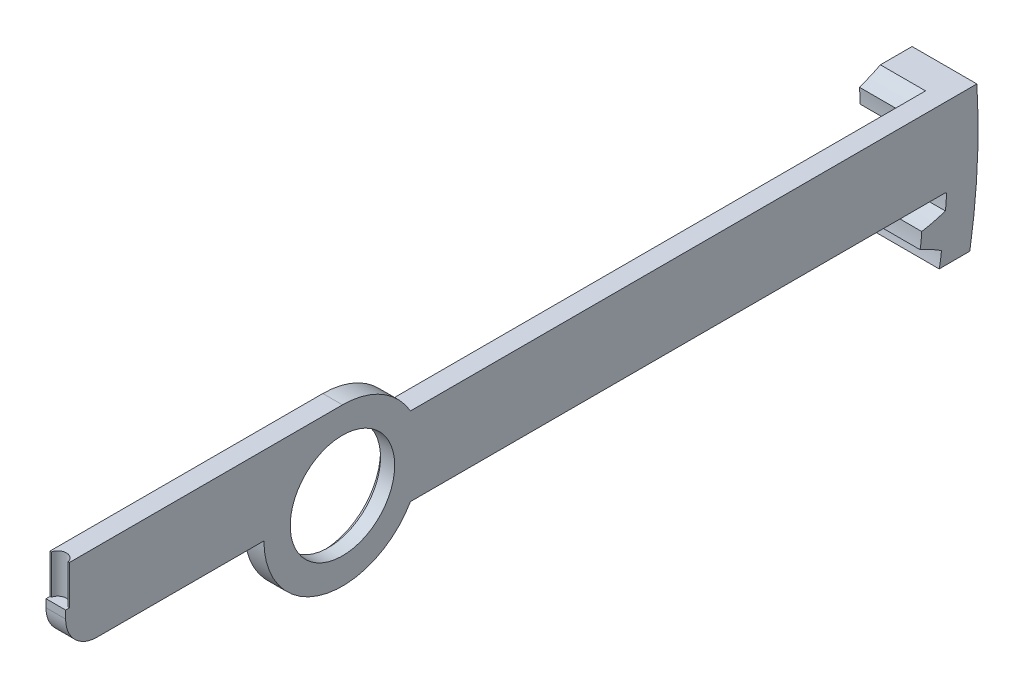
ISO-10303-21;
HEADER;
FILE_DESCRIPTION(('STEP AP214'),'2;1');
FILE_NAME('part.step','',(''),(''),'','','');
FILE_SCHEMA(('AUTOMOTIVE_DESIGN { 1 0 10303 214 1 1 1 1 }'));
ENDSEC;
DATA;
#1=APPLICATION_CONTEXT('core data for automotive mechanical design processes');
#2=APPLICATION_PROTOCOL_DEFINITION('international standard','automotive_design',2000,#1);
#3=PRODUCT_CONTEXT('',#1,'mechanical');
#4=PRODUCT('Part','Part','',(#3));
#5=PRODUCT_RELATED_PRODUCT_CATEGORY('part','',(#4));
#6=PRODUCT_DEFINITION_FORMATION('','',#4);
#7=PRODUCT_DEFINITION_CONTEXT('part definition',#1,'design');
#8=PRODUCT_DEFINITION('design','',#6,#7);
#9=PRODUCT_DEFINITION_SHAPE('','',#8);
#10=(LENGTH_UNIT() NAMED_UNIT(*) SI_UNIT(.MILLI.,.METRE.));
#11=(NAMED_UNIT(*) PLANE_ANGLE_UNIT() SI_UNIT($,.RADIAN.));
#12=(NAMED_UNIT(*) SI_UNIT($,.STERADIAN.) SOLID_ANGLE_UNIT());
#13=UNCERTAINTY_MEASURE_WITH_UNIT(LENGTH_MEASURE(1.E-05),#10,'distance_accuracy_value','');
#14=(GEOMETRIC_REPRESENTATION_CONTEXT(3) GLOBAL_UNCERTAINTY_ASSIGNED_CONTEXT((#13)) GLOBAL_UNIT_ASSIGNED_CONTEXT((#10,
#11,#12)) REPRESENTATION_CONTEXT('',''));
#15=CARTESIAN_POINT('',(0.,0.,0.));
#16=DIRECTION('',(0.,0.,1.));
#17=DIRECTION('',(1.,0.,0.));
#18=AXIS2_PLACEMENT_3D('',#15,#16,#17);
#19=CARTESIAN_POINT('',(1.25,0.,0.));
#20=DIRECTION('',(1.,0.,0.));
#21=DIRECTION('',(0.,0.,-1.));
#22=AXIS2_PLACEMENT_3D('',#19,#20,#21);
#23=PLANE('',#22);
#24=CARTESIAN_POINT('',(1.25,0.,0.));
#25=DIRECTION('',(1.,0.,0.));
#26=DIRECTION('',(0.,0.,-1.));
#27=AXIS2_PLACEMENT_3D('',#24,#25,#26);
#28=CIRCLE('',#27,6.65);
#29=CARTESIAN_POINT('',(1.25,0.,-6.65));
#30=VERTEX_POINT('',#29);
#31=EDGE_CURVE('E342',#30,#30,#28,.T.);
#32=ORIENTED_EDGE('',*,*,#31,.F.);
#33=EDGE_LOOP('',(#32));
#34=FACE_BOUND('',#33,.T.);
#35=CARTESIAN_POINT('',(1.25,0.,0.));
#36=DIRECTION('',(1.,0.,0.));
#37=DIRECTION('',(0.,0.,-1.));
#38=AXIS2_PLACEMENT_3D('',#35,#36,#37);
#39=CIRCLE('',#38,80.9419522496424);
#40=CARTESIAN_POINT('',(1.25,-13.,-79.8911736926139));
#41=VERTEX_POINT('',#40);
#42=CARTESIAN_POINT('',(1.25,5.00000000000251,-80.7873729860266));
#43=VERTEX_POINT('',#42);
#44=EDGE_CURVE('E273',#41,#43,#39,.T.);
#45=ORIENTED_EDGE('',*,*,#44,.T.);
#46=DIRECTION('',(0.,0.,-1.));
#47=VECTOR('',#46,1.);
#48=CARTESIAN_POINT('',(1.25,5.00000000000256,0.));
#49=LINE('',#48,#47);
#50=CARTESIAN_POINT('',(1.25,5.00000000000215,-8.66025403784314));
#51=VERTEX_POINT('',#50);
#52=EDGE_CURVE('E333',#51,#43,#49,.T.);
#53=ORIENTED_EDGE('',*,*,#52,.F.);
#54=CARTESIAN_POINT('',(1.25,0.,0.));
#55=DIRECTION('',(1.,0.,0.));
#56=DIRECTION('',(0.,0.,-1.));
#57=AXIS2_PLACEMENT_3D('',#54,#55,#56);
#58=CIRCLE('',#57,10.);
#59=CARTESIAN_POINT('',(1.25,9.99999999999999,0.));
#60=VERTEX_POINT('',#59);
#61=EDGE_CURVE('E330',#51,#60,#58,.T.);
#62=ORIENTED_EDGE('',*,*,#61,.T.);
#63=DIRECTION('',(0.,0.,1.));
#64=VECTOR('',#63,1.);
#65=CARTESIAN_POINT('',(1.25,9.99999999999999,0.));
#66=LINE('',#65,#64);
#67=CARTESIAN_POINT('',(1.25,9.99999999999999,34.75));
#68=VERTEX_POINT('',#67);
#69=EDGE_CURVE('E335',#60,#68,#66,.T.);
#70=ORIENTED_EDGE('',*,*,#69,.T.);
#71=DIRECTION('',(0.,-1.,0.));
#72=VECTOR('',#71,1.);
#73=CARTESIAN_POINT('',(1.25,0.,34.75));
#74=LINE('',#73,#72);
#75=CARTESIAN_POINT('',(1.25,4.99999999999999,34.75));
#76=VERTEX_POINT('',#75);
#77=EDGE_CURVE('E337',#68,#76,#74,.T.);
#78=ORIENTED_EDGE('',*,*,#77,.T.);
#79=DIRECTION('',(0.,0.,-1.));
#80=VECTOR('',#79,1.);
#81=CARTESIAN_POINT('',(1.25,4.99999999999999,0.));
#82=LINE('',#81,#80);
#83=CARTESIAN_POINT('',(1.25,4.99999999999999,35.25));
#84=VERTEX_POINT('',#83);
#85=EDGE_CURVE('E339',#84,#76,#82,.T.);
#86=ORIENTED_EDGE('',*,*,#85,.F.);
#87=DIRECTION('',(0.,-1.,0.));
#88=VECTOR('',#87,1.);
#89=CARTESIAN_POINT('',(1.25,0.,35.25));
#90=LINE('',#89,#88);
#91=CARTESIAN_POINT('',(1.25,4.00000000000002,35.25));
#92=VERTEX_POINT('',#91);
#93=EDGE_CURVE('E318',#84,#92,#90,.T.);
#94=ORIENTED_EDGE('',*,*,#93,.T.);
#95=CARTESIAN_POINT('',(1.25,4.,31.25));
#96=DIRECTION('',(1.,0.,0.));
#97=DIRECTION('',(0.,0.,-1.));
#98=AXIS2_PLACEMENT_3D('',#95,#96,#97);
#99=CIRCLE('',#98,4.);
#100=CARTESIAN_POINT('',(1.25,0.,31.25));
#101=VERTEX_POINT('',#100);
#102=EDGE_CURVE('E321',#92,#101,#99,.T.);
#103=ORIENTED_EDGE('',*,*,#102,.T.);
#104=DIRECTION('',(0.,0.,1.));
#105=VECTOR('',#104,1.);
#106=CARTESIAN_POINT('',(1.25,0.,0.));
#107=LINE('',#106,#105);
#108=CARTESIAN_POINT('',(1.25,0.,10.));
#109=VERTEX_POINT('',#108);
#110=EDGE_CURVE('E324',#109,#101,#107,.T.);
#111=ORIENTED_EDGE('',*,*,#110,.F.);
#112=CARTESIAN_POINT('',(1.25,-5.00000000000216,-8.66025403784314));
#113=VERTEX_POINT('',#112);
#114=EDGE_CURVE('E327',#109,#113,#58,.T.);
#115=ORIENTED_EDGE('',*,*,#114,.T.);
#116=DIRECTION('',(0.,0.,1.));
#117=VECTOR('',#116,1.);
#118=CARTESIAN_POINT('',(1.25,-5.00000000000211,0.));
#119=LINE('',#118,#117);
#120=CARTESIAN_POINT('',(1.25,-5.00000000000254,-76.7218475415711));
#121=VERTEX_POINT('',#120);
#122=EDGE_CURVE('E329',#121,#113,#119,.T.);
#123=ORIENTED_EDGE('',*,*,#122,.F.);
#124=CARTESIAN_POINT('',(1.25,-23.6162162985407,-67.1556357708977));
#125=DIRECTION('',(1.,0.,0.));
#126=DIRECTION('',(0.,0.,-1.));
#127=AXIS2_PLACEMENT_3D('',#124,#125,#126);
#128=CIRCLE('',#127,20.9302631831359);
#129=CARTESIAN_POINT('',(1.25,-5.1035048029999,-76.9206462674721));
#130=VERTEX_POINT('',#129);
#131=EDGE_CURVE('E276',#130,#121,#128,.T.);
#132=ORIENTED_EDGE('',*,*,#131,.F.);
#133=CARTESIAN_POINT('',(1.25,-4.60571823015363,-57.9501761356954));
#134=DIRECTION('',(1.,0.,0.));
#135=DIRECTION('',(0.,0.,-1.));
#136=AXIS2_PLACEMENT_3D('',#133,#134,#135);
#137=CIRCLE('',#136,18.9769999866347);
#138=CARTESIAN_POINT('',(1.25,-7.00493193495975,-76.7749019528595));
#139=VERTEX_POINT('',#138);
#140=EDGE_CURVE('E279',#130,#139,#137,.F.);
#141=ORIENTED_EDGE('',*,*,#140,.T.);
#142=CARTESIAN_POINT('',(1.25,10.9578906175946,-70.6255537554951));
#143=DIRECTION('',(1.,0.,0.));
#144=DIRECTION('',(0.,0.,-1.));
#145=AXIS2_PLACEMENT_3D('',#142,#143,#144);
#146=CIRCLE('',#145,18.9862444234499);
#147=CARTESIAN_POINT('',(1.25,-7.76663181357915,-73.7671675177918));
#148=VERTEX_POINT('',#147);
#149=EDGE_CURVE('E281',#148,#139,#146,.T.);
#150=ORIENTED_EDGE('',*,*,#149,.F.);
#151=CARTESIAN_POINT('',(1.25,-6.90534373335352,-57.0702324075885));
#152=DIRECTION('',(1.,0.,0.));
#153=DIRECTION('',(0.,0.,-1.));
#154=AXIS2_PLACEMENT_3D('',#151,#152,#153);
#155=CIRCLE('',#154,16.7191345239971);
#156=CARTESIAN_POINT('',(1.25,-9.66965269382754,-73.5592607356179));
#157=VERTEX_POINT('',#156);
#158=EDGE_CURVE('E284',#148,#157,#155,.F.);
#159=ORIENTED_EDGE('',*,*,#158,.T.);
#160=CARTESIAN_POINT('',(1.25,-28.8123858408192,-65.0957103825798));
#161=DIRECTION('',(1.,0.,0.));
#162=DIRECTION('',(0.,0.,-1.));
#163=AXIS2_PLACEMENT_3D('',#160,#161,#162);
#164=CIRCLE('',#163,20.9302631831359);
#165=CARTESIAN_POINT('',(1.25,-11.1228967498483,-76.2831092141112));
#166=VERTEX_POINT('',#165);
#167=EDGE_CURVE('E286',#166,#157,#164,.T.);
#168=ORIENTED_EDGE('',*,*,#167,.F.);
#169=CARTESIAN_POINT('',(1.25,-9.13823875480682,-57.4101745950475));
#170=DIRECTION('',(1.,0.,0.));
#171=DIRECTION('',(0.,0.,-1.));
#172=AXIS2_PLACEMENT_3D('',#169,#170,#171);
#173=CIRCLE('',#172,18.9769999866347);
#174=CARTESIAN_POINT('',(1.25,-13.0070274493974,-75.988629927215));
#175=VERTEX_POINT('',#174);
#176=EDGE_CURVE('E289',#166,#175,#173,.F.);
#177=ORIENTED_EDGE('',*,*,#176,.T.);
#178=DIRECTION('',(0.,-0.00180073265699237,0.999998378679635));
#179=VECTOR('',#178,1.);
#180=CARTESIAN_POINT('',(1.25,-13.143820257931,-0.0236685447503879));
#181=LINE('',#180,#179);
#182=EDGE_CURVE('E270',#41,#175,#181,.T.);
#183=ORIENTED_EDGE('',*,*,#182,.F.);
#184=EDGE_LOOP('',(#45,#53,#62,#70,#78,#86,#94,#103,#111,#115,#123,#132,#141,#150,#159,#168,
#177,#183));
#185=FACE_BOUND('',#184,.T.);
#186=ADVANCED_FACE('F37',(#34,#185),#23,.T.);
#187=CARTESIAN_POINT('',(1.25,0.,0.));
#188=DIRECTION('',(-1.,0.,0.));
#189=DIRECTION('',(0.,0.,1.));
#190=AXIS2_PLACEMENT_3D('',#187,#188,#189);
#191=CYLINDRICAL_SURFACE('',#190,80.9419522496424);
#192=DIRECTION('',(-1.,0.,0.));
#193=VECTOR('',#192,1.);
#194=CARTESIAN_POINT('',(1.25,5.00000000000251,-80.7873729860266));
#195=LINE('',#194,#193);
#196=CARTESIAN_POINT('',(-7.,5.00000000000251,-80.7873729860266));
#197=VERTEX_POINT('',#196);
#198=EDGE_CURVE('E51',#43,#197,#195,.T.);
#199=ORIENTED_EDGE('',*,*,#198,.F.);
#200=ORIENTED_EDGE('',*,*,#44,.F.);
#201=DIRECTION('',(-1.,0.,0.));
#202=VECTOR('',#201,1.);
#203=CARTESIAN_POINT('',(1.25,-13.,-79.8911736926139));
#204=LINE('',#203,#202);
#205=CARTESIAN_POINT('',(-7.,-13.,-79.8911736926139));
#206=VERTEX_POINT('',#205);
#207=EDGE_CURVE('E315',#41,#206,#204,.T.);
#208=ORIENTED_EDGE('',*,*,#207,.T.);
#209=CARTESIAN_POINT('',(-7.,0.,0.));
#210=DIRECTION('',(1.,0.,0.));
#211=DIRECTION('',(0.,0.,-1.));
#212=AXIS2_PLACEMENT_3D('',#209,#210,#211);
#213=CIRCLE('',#212,80.9419522496424);
#214=EDGE_CURVE('E234',#206,#197,#213,.T.);
#215=ORIENTED_EDGE('',*,*,#214,.T.);
#216=EDGE_LOOP('',(#199,#200,#208,#215));
#217=FACE_BOUND('',#216,.T.);
#218=ADVANCED_FACE('F541',(#217),#191,.T.);
#219=CARTESIAN_POINT('',(1.25,21.8712515204259,-68.0418442356442));
#220=DIRECTION('',(-1.,0.,0.));
#221=DIRECTION('',(0.,0.,1.));
#222=AXIS2_PLACEMENT_3D('',#219,#220,#221);
#223=CYLINDRICAL_SURFACE('',#222,18.9862444234499);
#224=CARTESIAN_POINT('',(-1.25,21.8712515204259,-68.0418442356442));
#225=DIRECTION('',(1.,0.,0.));
#226=DIRECTION('',(0.,0.,-1.));
#227=AXIS2_PLACEMENT_3D('',#224,#225,#226);
#228=CIRCLE('',#227,18.9862444234499);
#229=CARTESIAN_POINT('',(-1.25,3.86871570021124,-74.0739401689721));
#230=VERTEX_POINT('',#229);
#231=CARTESIAN_POINT('',(-1.25,5.00000000000251,-76.7503658921365));
#232=VERTEX_POINT('',#231);
#233=EDGE_CURVE('E228',#230,#232,#228,.T.);
#234=ORIENTED_EDGE('',*,*,#233,.T.);
#235=DIRECTION('',(-1.,0.,0.));
#236=VECTOR('',#235,1.);
#237=CARTESIAN_POINT('',(1.25,5.00000000000251,-76.7503658921365));
#238=LINE('',#237,#236);
#239=CARTESIAN_POINT('',(-7.,5.00000000000251,-76.7503658921365));
#240=VERTEX_POINT('',#239);
#241=EDGE_CURVE('E216',#232,#240,#238,.T.);
#242=ORIENTED_EDGE('',*,*,#241,.T.);
#243=CARTESIAN_POINT('',(-7.,21.8712515204259,-68.0418442356442));
#244=DIRECTION('',(1.,0.,0.));
#245=DIRECTION('',(0.,0.,-1.));
#246=AXIS2_PLACEMENT_3D('',#243,#244,#245);
#247=CIRCLE('',#246,18.9862444234499);
#248=CARTESIAN_POINT('',(-7.,3.86871570021124,-74.0739401689721));
#249=VERTEX_POINT('',#248);
#250=EDGE_CURVE('E226',#249,#240,#247,.T.);
#251=ORIENTED_EDGE('',*,*,#250,.F.);
#252=DIRECTION('',(-1.,0.,0.));
#253=VECTOR('',#252,1.);
#254=CARTESIAN_POINT('',(1.25,3.86871570021124,-74.0739401689721));
#255=LINE('',#254,#253);
#256=EDGE_CURVE('E313',#230,#249,#255,.T.);
#257=ORIENTED_EDGE('',*,*,#256,.F.);
#258=EDGE_LOOP('',(#234,#242,#251,#257));
#259=FACE_BOUND('',#258,.T.);
#260=ADVANCED_FACE('F224',(#259),#223,.F.);
#261=CARTESIAN_POINT('',(-7.,0.,0.));
#262=DIRECTION('',(1.,0.,0.));
#263=DIRECTION('',(0.,0.,-1.));
#264=AXIS2_PLACEMENT_3D('',#261,#262,#263);
#265=PLANE('',#264);
#266=DIRECTION('',(0.,0.,1.));
#267=VECTOR('',#266,1.);
#268=CARTESIAN_POINT('',(-7.,5.00000000000251,0.));
#269=LINE('',#268,#267);
#270=EDGE_CURVE('E11',#197,#240,#269,.T.);
#271=ORIENTED_EDGE('',*,*,#270,.F.);
#272=ORIENTED_EDGE('',*,*,#214,.F.);
#273=DIRECTION('',(0.,-0.00180073265699237,0.999998378679635));
#274=VECTOR('',#273,1.);
#275=CARTESIAN_POINT('',(-7.,-13.143820257931,-0.0236685447503879));
#276=LINE('',#275,#274);
#277=CARTESIAN_POINT('',(-7.,-13.0070274493974,-75.988629927215));
#278=VERTEX_POINT('',#277);
#279=EDGE_CURVE('E238',#206,#278,#276,.T.);
#280=ORIENTED_EDGE('',*,*,#279,.T.);
#281=CARTESIAN_POINT('',(-7.,-9.13823875480682,-57.4101745950475));
#282=DIRECTION('',(1.,0.,0.));
#283=DIRECTION('',(0.,0.,-1.));
#284=AXIS2_PLACEMENT_3D('',#281,#282,#283);
#285=CIRCLE('',#284,18.9769999866347);
#286=CARTESIAN_POINT('',(-7.,-11.1228967498483,-76.2831092141112));
#287=VERTEX_POINT('',#286);
#288=EDGE_CURVE('E267',#287,#278,#285,.F.);
#289=ORIENTED_EDGE('',*,*,#288,.F.);
#290=CARTESIAN_POINT('',(-7.,-28.8123858408192,-65.0957103825798));
#291=DIRECTION('',(1.,0.,0.));
#292=DIRECTION('',(0.,0.,-1.));
#293=AXIS2_PLACEMENT_3D('',#290,#291,#292);
#294=CIRCLE('',#293,20.9302631831359);
#295=CARTESIAN_POINT('',(-7.,-9.66965269382754,-73.5592607356179));
#296=VERTEX_POINT('',#295);
#297=EDGE_CURVE('E264',#287,#296,#294,.T.);
#298=ORIENTED_EDGE('',*,*,#297,.T.);
#299=CARTESIAN_POINT('',(-7.,-6.90534373335352,-57.0702324075885));
#300=DIRECTION('',(1.,0.,0.));
#301=DIRECTION('',(0.,0.,-1.));
#302=AXIS2_PLACEMENT_3D('',#299,#300,#301);
#303=CIRCLE('',#302,16.7191345239971);
#304=CARTESIAN_POINT('',(-7.,-7.76663181357915,-73.7671675177918));
#305=VERTEX_POINT('',#304);
#306=EDGE_CURVE('E261',#305,#296,#303,.F.);
#307=ORIENTED_EDGE('',*,*,#306,.F.);
#308=CARTESIAN_POINT('',(-7.,10.9578906175946,-70.6255537554951));
#309=DIRECTION('',(1.,0.,0.));
#310=DIRECTION('',(0.,0.,-1.));
#311=AXIS2_PLACEMENT_3D('',#308,#309,#310);
#312=CIRCLE('',#311,18.9862444234499);
#313=CARTESIAN_POINT('',(-7.,-7.00493193495975,-76.7749019528595));
#314=VERTEX_POINT('',#313);
#315=EDGE_CURVE('E258',#305,#314,#312,.T.);
#316=ORIENTED_EDGE('',*,*,#315,.T.);
#317=CARTESIAN_POINT('',(-7.,-4.60571823015363,-57.9501761356954));
#318=DIRECTION('',(1.,0.,0.));
#319=DIRECTION('',(0.,0.,-1.));
#320=AXIS2_PLACEMENT_3D('',#317,#318,#319);
#321=CIRCLE('',#320,18.9769999866347);
#322=CARTESIAN_POINT('',(-7.,-5.1035048029999,-76.9206462674721));
#323=VERTEX_POINT('',#322);
#324=EDGE_CURVE('E255',#323,#314,#321,.F.);
#325=ORIENTED_EDGE('',*,*,#324,.F.);
#326=CARTESIAN_POINT('',(-7.,-23.6162162985407,-67.1556357708977));
#327=DIRECTION('',(1.,0.,0.));
#328=DIRECTION('',(0.,0.,-1.));
#329=AXIS2_PLACEMENT_3D('',#326,#327,#328);
#330=CIRCLE('',#329,20.9302631831359);
#331=CARTESIAN_POINT('',(-7.,-3.8684513019306,-74.0911742902917));
#332=VERTEX_POINT('',#331);
#333=EDGE_CURVE('E252',#323,#332,#330,.T.);
#334=ORIENTED_EDGE('',*,*,#333,.T.);
#335=CARTESIAN_POINT('',(-7.,-2.40637803548819,-57.436090952312));
#336=DIRECTION('',(1.,0.,0.));
#337=DIRECTION('',(0.,0.,-1.));
#338=AXIS2_PLACEMENT_3D('',#335,#336,#337);
#339=CIRCLE('',#338,16.7191345239954);
#340=CARTESIAN_POINT('',(-7.,-1.95498462182996,-74.1491308678259));
#341=VERTEX_POINT('',#340);
#342=EDGE_CURVE('E249',#341,#332,#339,.F.);
#343=ORIENTED_EDGE('',*,*,#342,.F.);
#344=CARTESIAN_POINT('',(-7.,16.4653281807661,-69.5480925544124));
#345=DIRECTION('',(1.,0.,0.));
#346=DIRECTION('',(0.,0.,-1.));
#347=AXIS2_PLACEMENT_3D('',#344,#345,#346);
#348=CIRCLE('',#347,18.9862444234499);
#349=CARTESIAN_POINT('',(-7.,-0.959648685766831,-77.0878311777188));
#350=VERTEX_POINT('',#349);
#351=EDGE_CURVE('E246',#341,#350,#348,.T.);
#352=ORIENTED_EDGE('',*,*,#351,.T.);
#353=CARTESIAN_POINT('',(-7.,-0.0448019210548617,-58.1328955700775));
#354=DIRECTION('',(1.,0.,0.));
#355=DIRECTION('',(0.,0.,-1.));
#356=AXIS2_PLACEMENT_3D('',#353,#354,#355);
#357=CIRCLE('',#356,18.9769999866347);
#358=CARTESIAN_POINT('',(-7.,0.947351948046231,-77.0839419578831));
#359=VERTEX_POINT('',#358);
#360=EDGE_CURVE('E243',#359,#350,#357,.F.);
#361=ORIENTED_EDGE('',*,*,#360,.F.);
#362=CARTESIAN_POINT('',(-7.,-18.2744449295929,-68.8015243331729));
#363=DIRECTION('',(1.,0.,0.));
#364=DIRECTION('',(0.,0.,-1.));
#365=AXIS2_PLACEMENT_3D('',#362,#363,#364);
#366=CIRCLE('',#365,20.9302631831357);
#367=CARTESIAN_POINT('',(-7.,1.95660037863342,-74.1662911176493));
#368=VERTEX_POINT('',#367);
#369=EDGE_CURVE('E236',#359,#368,#366,.T.);
#370=ORIENTED_EDGE('',*,*,#369,.T.);
#371=CARTESIAN_POINT('',(-7.,2.10742378316781,-57.447836896876));
#372=DIRECTION('',(1.,0.,0.));
#373=DIRECTION('',(0.,0.,-1.));
#374=AXIS2_PLACEMENT_3D('',#371,#372,#373);
#375=CIRCLE('',#374,16.7191345239952);
#376=EDGE_CURVE('E233',#249,#368,#375,.F.);
#377=ORIENTED_EDGE('',*,*,#376,.F.);
#378=ORIENTED_EDGE('',*,*,#250,.T.);
#379=EDGE_LOOP('',(#271,#272,#280,#289,#298,#307,#316,#325,#334,#343,#352,#361,#370,#377,#378));
#380=FACE_BOUND('',#379,.T.);
#381=ADVANCED_FACE('F230',(#380),#265,.F.);
#382=CARTESIAN_POINT('',(1.25,0.,34.75));
#383=DIRECTION('',(0.,0.,-1.));
#384=DIRECTION('',(-1.,0.,0.));
#385=AXIS2_PLACEMENT_3D('',#382,#383,#384);
#386=PLANE('',#385);
#387=DIRECTION('',(-1.,0.,0.));
#388=VECTOR('',#387,1.);
#389=CARTESIAN_POINT('',(1.25,4.99999999999999,34.75));
#390=LINE('',#389,#388);
#391=CARTESIAN_POINT('',(-1.07121426428143,4.99999999999999,34.75));
#392=VERTEX_POINT('',#391);
#393=CARTESIAN_POINT('',(-1.25,4.99999999999999,34.75));
#394=VERTEX_POINT('',#393);
#395=EDGE_CURVE('E388',#392,#394,#390,.T.);
#396=ORIENTED_EDGE('',*,*,#395,.F.);
#397=DIRECTION('',(0.,1.,0.));
#398=VECTOR('',#397,1.);
#399=CARTESIAN_POINT('',(-1.07121426428143,4.99999999999999,34.75));
#400=LINE('',#399,#398);
#401=CARTESIAN_POINT('',(-1.07121426428143,9.99999999999999,34.75));
#402=VERTEX_POINT('',#401);
#403=EDGE_CURVE('E505',#392,#402,#400,.T.);
#404=ORIENTED_EDGE('',*,*,#403,.T.);
#405=DIRECTION('',(-1.,0.,0.));
#406=VECTOR('',#405,1.);
#407=CARTESIAN_POINT('',(1.25,9.99999999999999,34.75));
#408=LINE('',#407,#406);
#409=CARTESIAN_POINT('',(-1.25,9.99999999999999,34.75));
#410=VERTEX_POINT('',#409);
#411=EDGE_CURVE('E391',#402,#410,#408,.T.);
#412=ORIENTED_EDGE('',*,*,#411,.T.);
#413=DIRECTION('',(0.,-1.,0.));
#414=VECTOR('',#413,1.);
#415=CARTESIAN_POINT('',(-1.25,0.,34.75));
#416=LINE('',#415,#414);
#417=EDGE_CURVE('E382',#410,#394,#416,.T.);
#418=ORIENTED_EDGE('',*,*,#417,.T.);
#419=EDGE_LOOP('',(#396,#404,#412,#418));
#420=FACE_BOUND('',#419,.T.);
#421=ADVANCED_FACE('F440',(#420),#386,.F.);
#422=CARTESIAN_POINT('',(1.25,0.,35.25));
#423=DIRECTION('',(0.,0.,-1.));
#424=DIRECTION('',(-1.,0.,0.));
#425=AXIS2_PLACEMENT_3D('',#422,#423,#424);
#426=PLANE('',#425);
#427=DIRECTION('',(0.,-1.,0.));
#428=VECTOR('',#427,1.);
#429=CARTESIAN_POINT('',(-1.25,0.,35.25));
#430=LINE('',#429,#428);
#431=CARTESIAN_POINT('',(-1.25,4.99999999999999,35.25));
#432=VERTEX_POINT('',#431);
#433=CARTESIAN_POINT('',(-1.25,4.00000000000002,35.25));
#434=VERTEX_POINT('',#433);
#435=EDGE_CURVE('E317',#432,#434,#430,.T.);
#436=ORIENTED_EDGE('',*,*,#435,.T.);
#437=DIRECTION('',(-1.,0.,0.));
#438=VECTOR('',#437,1.);
#439=CARTESIAN_POINT('',(1.25,4.00000000000002,35.25));
#440=LINE('',#439,#438);
#441=EDGE_CURVE('E409',#92,#434,#440,.T.);
#442=ORIENTED_EDGE('',*,*,#441,.F.);
#443=ORIENTED_EDGE('',*,*,#93,.F.);
#444=DIRECTION('',(-1.,0.,0.));
#445=VECTOR('',#444,1.);
#446=CARTESIAN_POINT('',(1.25,4.99999999999999,35.25));
#447=LINE('',#446,#445);
#448=EDGE_CURVE('E345',#84,#432,#447,.T.);
#449=ORIENTED_EDGE('',*,*,#448,.T.);
#450=EDGE_LOOP('',(#436,#442,#443,#449));
#451=FACE_BOUND('',#450,.T.);
#452=ADVANCED_FACE('F496',(#451),#426,.F.);
#453=CARTESIAN_POINT('',(1.25,4.,31.25));
#454=DIRECTION('',(-1.,0.,0.));
#455=DIRECTION('',(0.,0.,1.));
#456=AXIS2_PLACEMENT_3D('',#453,#454,#455);
#457=CYLINDRICAL_SURFACE('',#456,4.);
#458=CARTESIAN_POINT('',(-1.25,4.,31.25));
#459=DIRECTION('',(1.,0.,0.));
#460=DIRECTION('',(0.,0.,-1.));
#461=AXIS2_PLACEMENT_3D('',#458,#459,#460);
#462=CIRCLE('',#461,4.);
#463=CARTESIAN_POINT('',(-1.25,0.,31.25));
#464=VERTEX_POINT('',#463);
#465=EDGE_CURVE('E348',#434,#464,#462,.T.);
#466=ORIENTED_EDGE('',*,*,#465,.T.);
#467=DIRECTION('',(-1.,0.,0.));
#468=VECTOR('',#467,1.);
#469=CARTESIAN_POINT('',(1.25,0.,31.25));
#470=LINE('',#469,#468);
#471=EDGE_CURVE('E407',#101,#464,#470,.T.);
#472=ORIENTED_EDGE('',*,*,#471,.F.);
#473=ORIENTED_EDGE('',*,*,#102,.F.);
#474=ORIENTED_EDGE('',*,*,#441,.T.);
#475=EDGE_LOOP('',(#466,#472,#473,#474));
#476=FACE_BOUND('',#475,.T.);
#477=ADVANCED_FACE('F495',(#476),#457,.T.);
#478=CARTESIAN_POINT('',(1.25,0.,0.));
#479=DIRECTION('',(0.,-1.,0.));
#480=DIRECTION('',(0.,0.,-1.));
#481=AXIS2_PLACEMENT_3D('',#478,#479,#480);
#482=PLANE('',#481);
#483=DIRECTION('',(0.,0.,1.));
#484=VECTOR('',#483,1.);
#485=CARTESIAN_POINT('',(-1.25,0.,0.));
#486=LINE('',#485,#484);
#487=CARTESIAN_POINT('',(-1.25,0.,10.));
#488=VERTEX_POINT('',#487);
#489=EDGE_CURVE('E351',#488,#464,#486,.T.);
#490=ORIENTED_EDGE('',*,*,#489,.F.);
#491=DIRECTION('',(-1.,0.,0.));
#492=VECTOR('',#491,1.);
#493=CARTESIAN_POINT('',(1.25,0.,10.));
#494=LINE('',#493,#492);
#495=EDGE_CURVE('E405',#109,#488,#494,.T.);
#496=ORIENTED_EDGE('',*,*,#495,.F.);
#497=ORIENTED_EDGE('',*,*,#110,.T.);
#498=ORIENTED_EDGE('',*,*,#471,.T.);
#499=EDGE_LOOP('',(#490,#496,#497,#498));
#500=FACE_BOUND('',#499,.T.);
#501=ADVANCED_FACE('F492',(#500),#482,.T.);
#502=CARTESIAN_POINT('',(1.25,0.,0.));
#503=DIRECTION('',(-1.,0.,0.));
#504=DIRECTION('',(0.,0.,1.));
#505=AXIS2_PLACEMENT_3D('',#502,#503,#504);
#506=CYLINDRICAL_SURFACE('',#505,10.);
#507=CARTESIAN_POINT('',(-1.25,0.,0.));
#508=DIRECTION('',(1.,0.,0.));
#509=DIRECTION('',(0.,0.,-1.));
#510=AXIS2_PLACEMENT_3D('',#507,#508,#509);
#511=CIRCLE('',#510,10.);
#512=CARTESIAN_POINT('',(-1.25,-5.00000000000216,-8.66025403784314));
#513=VERTEX_POINT('',#512);
#514=EDGE_CURVE('E354',#488,#513,#511,.T.);
#515=ORIENTED_EDGE('',*,*,#514,.T.);
#516=DIRECTION('',(-1.,0.,0.));
#517=VECTOR('',#516,1.);
#518=CARTESIAN_POINT('',(1.25,-5.00000000000216,-8.66025403784314));
#519=LINE('',#518,#517);
#520=EDGE_CURVE('E403',#113,#513,#519,.T.);
#521=ORIENTED_EDGE('',*,*,#520,.F.);
#522=ORIENTED_EDGE('',*,*,#114,.F.);
#523=ORIENTED_EDGE('',*,*,#495,.T.);
#524=EDGE_LOOP('',(#515,#521,#522,#523));
#525=FACE_BOUND('',#524,.T.);
#526=ADVANCED_FACE('F488',(#525),#506,.T.);
#527=CARTESIAN_POINT('',(1.25,-5.00000000000211,0.));
#528=DIRECTION('',(0.,-1.,0.));
#529=DIRECTION('',(0.,0.,-1.));
#530=AXIS2_PLACEMENT_3D('',#527,#528,#529);
#531=PLANE('',#530);
#532=DIRECTION('',(0.,0.,1.));
#533=VECTOR('',#532,1.);
#534=CARTESIAN_POINT('',(-1.25,-5.00000000000211,0.));
#535=LINE('',#534,#533);
#536=CARTESIAN_POINT('',(-1.25,-5.00000000000254,-76.7218475415711));
#537=VERTEX_POINT('',#536);
#538=EDGE_CURVE('E357',#537,#513,#535,.T.);
#539=ORIENTED_EDGE('',*,*,#538,.F.);
#540=DIRECTION('',(-1.,0.,0.));
#541=VECTOR('',#540,1.);
#542=CARTESIAN_POINT('',(1.25,-5.00000000000254,-76.7218475415711));
#543=LINE('',#542,#541);
#544=EDGE_CURVE('E400',#121,#537,#543,.T.);
#545=ORIENTED_EDGE('',*,*,#544,.F.);
#546=ORIENTED_EDGE('',*,*,#122,.T.);
#547=ORIENTED_EDGE('',*,*,#520,.T.);
#548=EDGE_LOOP('',(#539,#545,#546,#547));
#549=FACE_BOUND('',#548,.T.);
#550=ADVANCED_FACE('F482',(#549),#531,.T.);
#551=CARTESIAN_POINT('',(1.25,5.00000000000256,0.));
#552=DIRECTION('',(0.,1.,0.));
#553=DIRECTION('',(0.,0.,1.));
#554=AXIS2_PLACEMENT_3D('',#551,#552,#553);
#555=PLANE('',#554);
#556=ORIENTED_EDGE('',*,*,#241,.F.);
#557=DIRECTION('',(0.,0.,-1.));
#558=VECTOR('',#557,1.);
#559=CARTESIAN_POINT('',(-1.25,5.00000000000256,0.));
#560=LINE('',#559,#558);
#561=CARTESIAN_POINT('',(-1.25,5.00000000000215,-8.66025403784314));
#562=VERTEX_POINT('',#561);
#563=EDGE_CURVE('E377',#562,#232,#560,.T.);
#564=ORIENTED_EDGE('',*,*,#563,.F.);
#565=DIRECTION('',(-1.,0.,0.));
#566=VECTOR('',#565,1.);
#567=CARTESIAN_POINT('',(1.25,5.00000000000215,-8.66025403784314));
#568=LINE('',#567,#566);
#569=EDGE_CURVE('E398',#51,#562,#568,.T.);
#570=ORIENTED_EDGE('',*,*,#569,.F.);
#571=ORIENTED_EDGE('',*,*,#52,.T.);
#572=ORIENTED_EDGE('',*,*,#198,.T.);
#573=ORIENTED_EDGE('',*,*,#270,.T.);
#574=EDGE_LOOP('',(#556,#564,#570,#571,#572,#573));
#575=FACE_BOUND('',#574,.T.);
#576=ADVANCED_FACE('F214',(#575),#555,.T.);
#577=CARTESIAN_POINT('',(-1.25,9.99999999999999,0.));
#578=VERTEX_POINT('',#577);
#579=EDGE_CURVE('E358',#562,#578,#511,.T.);
#580=ORIENTED_EDGE('',*,*,#579,.T.);
#581=DIRECTION('',(-1.,0.,0.));
#582=VECTOR('',#581,1.);
#583=CARTESIAN_POINT('',(1.25,9.99999999999999,0.));
#584=LINE('',#583,#582);
#585=EDGE_CURVE('E395',#60,#578,#584,.T.);
#586=ORIENTED_EDGE('',*,*,#585,.F.);
#587=ORIENTED_EDGE('',*,*,#61,.F.);
#588=ORIENTED_EDGE('',*,*,#569,.T.);
#589=EDGE_LOOP('',(#580,#586,#587,#588));
#590=FACE_BOUND('',#589,.T.);
#591=ADVANCED_FACE('F452',(#590),#506,.T.);
#592=CARTESIAN_POINT('',(1.25,9.99999999999999,0.));
#593=DIRECTION('',(0.,-1.,0.));
#594=DIRECTION('',(0.,0.,-1.));
#595=AXIS2_PLACEMENT_3D('',#592,#593,#594);
#596=PLANE('',#595);
#597=ORIENTED_EDGE('',*,*,#411,.F.);
#598=CARTESIAN_POINT('',(0.,9.99999999999999,35.));
#599=DIRECTION('',(0.,1.,0.));
#600=DIRECTION('',(0.,0.,1.));
#601=AXIS2_PLACEMENT_3D('',#598,#599,#600);
#602=CIRCLE('',#601,1.1);
#603=CARTESIAN_POINT('',(1.07121426428143,9.99999999999999,34.75));
#604=VERTEX_POINT('',#603);
#605=EDGE_CURVE('E508',#604,#402,#602,.T.);
#606=ORIENTED_EDGE('',*,*,#605,.F.);
#607=EDGE_CURVE('E392',#68,#604,#408,.T.);
#608=ORIENTED_EDGE('',*,*,#607,.F.);
#609=ORIENTED_EDGE('',*,*,#69,.F.);
#610=ORIENTED_EDGE('',*,*,#585,.T.);
#611=DIRECTION('',(0.,0.,1.));
#612=VECTOR('',#611,1.);
#613=CARTESIAN_POINT('',(-1.25,9.99999999999999,0.));
#614=LINE('',#613,#612);
#615=EDGE_CURVE('E379',#578,#410,#614,.T.);
#616=ORIENTED_EDGE('',*,*,#615,.T.);
#617=EDGE_LOOP('',(#597,#606,#608,#609,#610,#616));
#618=FACE_BOUND('',#617,.T.);
#619=ADVANCED_FACE('F445',(#618),#596,.F.);
#620=ORIENTED_EDGE('',*,*,#607,.T.);
#621=DIRECTION('',(0.,1.,0.));
#622=VECTOR('',#621,1.);
#623=CARTESIAN_POINT('',(1.07121426428143,4.99999999999999,34.75));
#624=LINE('',#623,#622);
#625=CARTESIAN_POINT('',(1.07121426428143,4.99999999999999,34.75));
#626=VERTEX_POINT('',#625);
#627=EDGE_CURVE('E503',#604,#626,#624,.F.);
#628=ORIENTED_EDGE('',*,*,#627,.T.);
#629=EDGE_CURVE('E389',#76,#626,#390,.T.);
#630=ORIENTED_EDGE('',*,*,#629,.F.);
#631=ORIENTED_EDGE('',*,*,#77,.F.);
#632=EDGE_LOOP('',(#620,#628,#630,#631));
#633=FACE_BOUND('',#632,.T.);
#634=ADVANCED_FACE('F502',(#633),#386,.F.);
#635=CARTESIAN_POINT('',(1.25,4.99999999999999,0.));
#636=DIRECTION('',(0.,1.,0.));
#637=DIRECTION('',(0.,0.,1.));
#638=AXIS2_PLACEMENT_3D('',#635,#636,#637);
#639=PLANE('',#638);
#640=DIRECTION('',(0.,0.,-1.));
#641=VECTOR('',#640,1.);
#642=CARTESIAN_POINT('',(-1.25,4.99999999999999,0.));
#643=LINE('',#642,#641);
#644=EDGE_CURVE('E322',#432,#394,#643,.T.);
#645=ORIENTED_EDGE('',*,*,#644,.F.);
#646=ORIENTED_EDGE('',*,*,#448,.F.);
#647=ORIENTED_EDGE('',*,*,#85,.T.);
#648=ORIENTED_EDGE('',*,*,#629,.T.);
#649=CARTESIAN_POINT('',(0.,4.99999999999999,35.));
#650=DIRECTION('',(0.,1.,0.));
#651=DIRECTION('',(0.,0.,1.));
#652=AXIS2_PLACEMENT_3D('',#649,#650,#651);
#653=CIRCLE('',#652,1.1);
#654=EDGE_CURVE('E59',#626,#392,#653,.T.);
#655=ORIENTED_EDGE('',*,*,#654,.T.);
#656=ORIENTED_EDGE('',*,*,#395,.T.);
#657=EDGE_LOOP('',(#645,#646,#647,#648,#655,#656));
#658=FACE_BOUND('',#657,.T.);
#659=ADVANCED_FACE('F435',(#658),#639,.T.);
#660=CARTESIAN_POINT('',(1.25,0.,0.));
#661=DIRECTION('',(-1.,0.,0.));
#662=DIRECTION('',(0.,0.,1.));
#663=AXIS2_PLACEMENT_3D('',#660,#661,#662);
#664=CYLINDRICAL_SURFACE('',#663,6.65);
#665=CARTESIAN_POINT('',(-0.549999999999977,0.,0.));
#666=DIRECTION('',(1.,0.,0.));
#667=DIRECTION('',(0.,0.,-1.));
#668=AXIS2_PLACEMENT_3D('',#665,#666,#667);
#669=CIRCLE('',#668,6.65);
#670=CARTESIAN_POINT('',(-0.549999999999977,0.,-6.65));
#671=VERTEX_POINT('',#670);
#672=EDGE_CURVE('E45',#671,#671,#669,.F.);
#673=ORIENTED_EDGE('',*,*,#672,.T.);
#674=EDGE_LOOP('',(#673));
#675=FACE_BOUND('',#674,.T.);
#676=ORIENTED_EDGE('',*,*,#31,.T.);
#677=EDGE_LOOP('',(#676));
#678=FACE_BOUND('',#677,.T.);
#679=ADVANCED_FACE('F417',(#675,#678),#664,.F.);
#680=CARTESIAN_POINT('',(-1.25,0.,0.));
#681=DIRECTION('',(1.,0.,0.));
#682=DIRECTION('',(0.,0.,-1.));
#683=AXIS2_PLACEMENT_3D('',#680,#681,#682);
#684=PLANE('',#683);
#685=CARTESIAN_POINT('',(-1.25,0.,0.));
#686=DIRECTION('',(1.,0.,0.));
#687=DIRECTION('',(0.,0.,-1.));
#688=AXIS2_PLACEMENT_3D('',#685,#686,#687);
#689=CIRCLE('',#688,7.35000000000001);
#690=CARTESIAN_POINT('',(-1.25,0.,-7.35000000000001));
#691=VERTEX_POINT('',#690);
#692=EDGE_CURVE('E412',#691,#691,#689,.T.);
#693=ORIENTED_EDGE('',*,*,#692,.T.);
#694=EDGE_LOOP('',(#693));
#695=FACE_BOUND('',#694,.T.);
#696=ORIENTED_EDGE('',*,*,#435,.F.);
#697=ORIENTED_EDGE('',*,*,#644,.T.);
#698=ORIENTED_EDGE('',*,*,#417,.F.);
#699=ORIENTED_EDGE('',*,*,#615,.F.);
#700=ORIENTED_EDGE('',*,*,#579,.F.);
#701=ORIENTED_EDGE('',*,*,#563,.T.);
#702=ORIENTED_EDGE('',*,*,#233,.F.);
#703=CARTESIAN_POINT('',(-1.25,2.10742378316781,-57.447836896876));
#704=DIRECTION('',(1.,0.,0.));
#705=DIRECTION('',(0.,0.,-1.));
#706=AXIS2_PLACEMENT_3D('',#703,#704,#705);
#707=CIRCLE('',#706,16.7191345239952);
#708=CARTESIAN_POINT('',(-1.25,1.95660037863342,-74.1662911176493));
#709=VERTEX_POINT('',#708);
#710=EDGE_CURVE('E374',#230,#709,#707,.F.);
#711=ORIENTED_EDGE('',*,*,#710,.T.);
#712=CARTESIAN_POINT('',(-1.25,-18.2744449295929,-68.8015243331729));
#713=DIRECTION('',(1.,0.,0.));
#714=DIRECTION('',(0.,0.,-1.));
#715=AXIS2_PLACEMENT_3D('',#712,#713,#714);
#716=CIRCLE('',#715,20.9302631831357);
#717=CARTESIAN_POINT('',(-1.25,0.947351948046231,-77.0839419578831));
#718=VERTEX_POINT('',#717);
#719=EDGE_CURVE('E371',#718,#709,#716,.T.);
#720=ORIENTED_EDGE('',*,*,#719,.F.);
#721=CARTESIAN_POINT('',(-1.25,-0.0448019210548617,-58.1328955700775));
#722=DIRECTION('',(1.,0.,0.));
#723=DIRECTION('',(0.,0.,-1.));
#724=AXIS2_PLACEMENT_3D('',#721,#722,#723);
#725=CIRCLE('',#724,18.9769999866347);
#726=CARTESIAN_POINT('',(-1.25,-0.959648685766831,-77.0878311777188));
#727=VERTEX_POINT('',#726);
#728=EDGE_CURVE('E369',#718,#727,#725,.F.);
#729=ORIENTED_EDGE('',*,*,#728,.T.);
#730=CARTESIAN_POINT('',(-1.25,16.4653281807661,-69.5480925544124));
#731=DIRECTION('',(1.,0.,0.));
#732=DIRECTION('',(0.,0.,-1.));
#733=AXIS2_PLACEMENT_3D('',#730,#731,#732);
#734=CIRCLE('',#733,18.9862444234499);
#735=CARTESIAN_POINT('',(-1.25,-1.95498462182996,-74.1491308678259));
#736=VERTEX_POINT('',#735);
#737=EDGE_CURVE('E366',#736,#727,#734,.T.);
#738=ORIENTED_EDGE('',*,*,#737,.F.);
#739=CARTESIAN_POINT('',(-1.25,-2.40637803548819,-57.436090952312));
#740=DIRECTION('',(1.,0.,0.));
#741=DIRECTION('',(0.,0.,-1.));
#742=AXIS2_PLACEMENT_3D('',#739,#740,#741);
#743=CIRCLE('',#742,16.7191345239954);
#744=CARTESIAN_POINT('',(-1.25,-3.8684513019306,-74.0911742902917));
#745=VERTEX_POINT('',#744);
#746=EDGE_CURVE('E364',#736,#745,#743,.F.);
#747=ORIENTED_EDGE('',*,*,#746,.T.);
#748=CARTESIAN_POINT('',(-1.25,-23.6162162985407,-67.1556357708977));
#749=DIRECTION('',(1.,0.,0.));
#750=DIRECTION('',(0.,0.,-1.));
#751=AXIS2_PLACEMENT_3D('',#748,#749,#750);
#752=CIRCLE('',#751,20.9302631831359);
#753=EDGE_CURVE('E361',#537,#745,#752,.T.);
#754=ORIENTED_EDGE('',*,*,#753,.F.);
#755=ORIENTED_EDGE('',*,*,#538,.T.);
#756=ORIENTED_EDGE('',*,*,#514,.F.);
#757=ORIENTED_EDGE('',*,*,#489,.T.);
#758=ORIENTED_EDGE('',*,*,#465,.F.);
#759=EDGE_LOOP('',(#696,#697,#698,#699,#700,#701,#702,#711,#720,#729,#738,#747,#754,#755,#756,
#757,#758));
#760=FACE_BOUND('',#759,.T.);
#761=ADVANCED_FACE('F425',(#695,#760),#684,.F.);
#762=CARTESIAN_POINT('',(1.25,2.10742378316781,-57.447836896876));
#763=DIRECTION('',(-1.,0.,0.));
#764=DIRECTION('',(0.,0.,1.));
#765=AXIS2_PLACEMENT_3D('',#762,#763,#764);
#766=CYLINDRICAL_SURFACE('',#765,16.7191345239952);
#767=DIRECTION('',(-1.,0.,0.));
#768=VECTOR('',#767,1.);
#769=CARTESIAN_POINT('',(1.25,1.95660037863342,-74.1662911176493));
#770=LINE('',#769,#768);
#771=EDGE_CURVE('E311',#709,#368,#770,.T.);
#772=ORIENTED_EDGE('',*,*,#771,.F.);
#773=ORIENTED_EDGE('',*,*,#710,.F.);
#774=ORIENTED_EDGE('',*,*,#256,.T.);
#775=ORIENTED_EDGE('',*,*,#376,.T.);
#776=EDGE_LOOP('',(#772,#773,#774,#775));
#777=FACE_BOUND('',#776,.T.);
#778=ADVANCED_FACE('F428',(#777),#766,.F.);
#779=CARTESIAN_POINT('',(1.25,-18.2744449295929,-68.8015243331729));
#780=DIRECTION('',(-1.,0.,0.));
#781=DIRECTION('',(0.,0.,1.));
#782=AXIS2_PLACEMENT_3D('',#779,#780,#781);
#783=CYLINDRICAL_SURFACE('',#782,20.9302631831357);
#784=ORIENTED_EDGE('',*,*,#719,.T.);
#785=ORIENTED_EDGE('',*,*,#771,.T.);
#786=ORIENTED_EDGE('',*,*,#369,.F.);
#787=DIRECTION('',(-1.,0.,0.));
#788=VECTOR('',#787,1.);
#789=CARTESIAN_POINT('',(1.25,0.947351948046231,-77.0839419578831));
#790=LINE('',#789,#788);
#791=EDGE_CURVE('E309',#718,#359,#790,.T.);
#792=ORIENTED_EDGE('',*,*,#791,.F.);
#793=EDGE_LOOP('',(#784,#785,#786,#792));
#794=FACE_BOUND('',#793,.T.);
#795=ADVANCED_FACE('F459',(#794),#783,.F.);
#796=CARTESIAN_POINT('',(1.25,-0.0448019210548617,-58.1328955700775));
#797=DIRECTION('',(-1.,0.,0.));
#798=DIRECTION('',(0.,0.,1.));
#799=AXIS2_PLACEMENT_3D('',#796,#797,#798);
#800=CYLINDRICAL_SURFACE('',#799,18.9769999866347);
#801=DIRECTION('',(-1.,0.,0.));
#802=VECTOR('',#801,1.);
#803=CARTESIAN_POINT('',(1.25,-0.959648685766831,-77.0878311777188));
#804=LINE('',#803,#802);
#805=EDGE_CURVE('E307',#727,#350,#804,.T.);
#806=ORIENTED_EDGE('',*,*,#805,.F.);
#807=ORIENTED_EDGE('',*,*,#728,.F.);
#808=ORIENTED_EDGE('',*,*,#791,.T.);
#809=ORIENTED_EDGE('',*,*,#360,.T.);
#810=EDGE_LOOP('',(#806,#807,#808,#809));
#811=FACE_BOUND('',#810,.T.);
#812=ADVANCED_FACE('F466',(#811),#800,.F.);
#813=CARTESIAN_POINT('',(1.25,16.4653281807661,-69.5480925544124));
#814=DIRECTION('',(-1.,0.,0.));
#815=DIRECTION('',(0.,0.,1.));
#816=AXIS2_PLACEMENT_3D('',#813,#814,#815);
#817=CYLINDRICAL_SURFACE('',#816,18.9862444234499);
#818=ORIENTED_EDGE('',*,*,#737,.T.);
#819=ORIENTED_EDGE('',*,*,#805,.T.);
#820=ORIENTED_EDGE('',*,*,#351,.F.);
#821=DIRECTION('',(-1.,0.,0.));
#822=VECTOR('',#821,1.);
#823=CARTESIAN_POINT('',(1.25,-1.95498462182996,-74.1491308678259));
#824=LINE('',#823,#822);
#825=EDGE_CURVE('E305',#736,#341,#824,.T.);
#826=ORIENTED_EDGE('',*,*,#825,.F.);
#827=EDGE_LOOP('',(#818,#819,#820,#826));
#828=FACE_BOUND('',#827,.T.);
#829=ADVANCED_FACE('F471',(#828),#817,.F.);
#830=CARTESIAN_POINT('',(1.25,-2.40637803548819,-57.436090952312));
#831=DIRECTION('',(-1.,0.,0.));
#832=DIRECTION('',(0.,0.,1.));
#833=AXIS2_PLACEMENT_3D('',#830,#831,#832);
#834=CYLINDRICAL_SURFACE('',#833,16.7191345239954);
#835=DIRECTION('',(-1.,0.,0.));
#836=VECTOR('',#835,1.);
#837=CARTESIAN_POINT('',(1.25,-3.8684513019306,-74.0911742902917));
#838=LINE('',#837,#836);
#839=EDGE_CURVE('E303',#745,#332,#838,.T.);
#840=ORIENTED_EDGE('',*,*,#839,.F.);
#841=ORIENTED_EDGE('',*,*,#746,.F.);
#842=ORIENTED_EDGE('',*,*,#825,.T.);
#843=ORIENTED_EDGE('',*,*,#342,.T.);
#844=EDGE_LOOP('',(#840,#841,#842,#843));
#845=FACE_BOUND('',#844,.T.);
#846=ADVANCED_FACE('F474',(#845),#834,.F.);
#847=CARTESIAN_POINT('',(1.25,-13.143820257931,-0.0236685447503879));
#848=DIRECTION('',(0.,-0.999998378679635,-0.00180073265699238));
#849=DIRECTION('',(0.,0.00180073265699238,-0.999998378679635));
#850=AXIS2_PLACEMENT_3D('',#847,#848,#849);
#851=PLANE('',#850);
#852=DIRECTION('',(-1.,0.,0.));
#853=VECTOR('',#852,1.);
#854=CARTESIAN_POINT('',(1.25,-13.0070274493974,-75.988629927215));
#855=LINE('',#854,#853);
#856=EDGE_CURVE('E291',#175,#278,#855,.T.);
#857=ORIENTED_EDGE('',*,*,#856,.T.);
#858=ORIENTED_EDGE('',*,*,#279,.F.);
#859=ORIENTED_EDGE('',*,*,#207,.F.);
#860=ORIENTED_EDGE('',*,*,#182,.T.);
#861=EDGE_LOOP('',(#857,#858,#859,#860));
#862=FACE_BOUND('',#861,.T.);
#863=ADVANCED_FACE('F539',(#862),#851,.T.);
#864=CARTESIAN_POINT('',(1.25,-23.6162162985407,-67.1556357708977));
#865=DIRECTION('',(-1.,0.,0.));
#866=DIRECTION('',(0.,0.,1.));
#867=AXIS2_PLACEMENT_3D('',#864,#865,#866);
#868=CYLINDRICAL_SURFACE('',#867,20.9302631831359);
#869=ORIENTED_EDGE('',*,*,#131,.T.);
#870=ORIENTED_EDGE('',*,*,#544,.T.);
#871=ORIENTED_EDGE('',*,*,#753,.T.);
#872=ORIENTED_EDGE('',*,*,#839,.T.);
#873=ORIENTED_EDGE('',*,*,#333,.F.);
#874=DIRECTION('',(-1.,0.,0.));
#875=VECTOR('',#874,1.);
#876=CARTESIAN_POINT('',(1.25,-5.1035048029999,-76.9206462674721));
#877=LINE('',#876,#875);
#878=EDGE_CURVE('E301',#130,#323,#877,.T.);
#879=ORIENTED_EDGE('',*,*,#878,.F.);
#880=EDGE_LOOP('',(#869,#870,#871,#872,#873,#879));
#881=FACE_BOUND('',#880,.T.);
#882=ADVANCED_FACE('F477',(#881),#868,.F.);
#883=CARTESIAN_POINT('',(1.25,-4.60571823015363,-57.9501761356954));
#884=DIRECTION('',(-1.,0.,0.));
#885=DIRECTION('',(0.,0.,1.));
#886=AXIS2_PLACEMENT_3D('',#883,#884,#885);
#887=CYLINDRICAL_SURFACE('',#886,18.9769999866347);
#888=ORIENTED_EDGE('',*,*,#878,.T.);
#889=ORIENTED_EDGE('',*,*,#324,.T.);
#890=DIRECTION('',(-1.,0.,0.));
#891=VECTOR('',#890,1.);
#892=CARTESIAN_POINT('',(1.25,-7.00493193495975,-76.7749019528595));
#893=LINE('',#892,#891);
#894=EDGE_CURVE('E299',#139,#314,#893,.T.);
#895=ORIENTED_EDGE('',*,*,#894,.F.);
#896=ORIENTED_EDGE('',*,*,#140,.F.);
#897=EDGE_LOOP('',(#888,#889,#895,#896));
#898=FACE_BOUND('',#897,.T.);
#899=ADVANCED_FACE('F535',(#898),#887,.F.);
#900=CARTESIAN_POINT('',(1.25,10.9578906175946,-70.6255537554951));
#901=DIRECTION('',(-1.,0.,0.));
#902=DIRECTION('',(0.,0.,1.));
#903=AXIS2_PLACEMENT_3D('',#900,#901,#902);
#904=CYLINDRICAL_SURFACE('',#903,18.9862444234499);
#905=ORIENTED_EDGE('',*,*,#894,.T.);
#906=ORIENTED_EDGE('',*,*,#315,.F.);
#907=DIRECTION('',(-1.,0.,0.));
#908=VECTOR('',#907,1.);
#909=CARTESIAN_POINT('',(1.25,-7.76663181357915,-73.7671675177918));
#910=LINE('',#909,#908);
#911=EDGE_CURVE('E297',#148,#305,#910,.T.);
#912=ORIENTED_EDGE('',*,*,#911,.F.);
#913=ORIENTED_EDGE('',*,*,#149,.T.);
#914=EDGE_LOOP('',(#905,#906,#912,#913));
#915=FACE_BOUND('',#914,.T.);
#916=ADVANCED_FACE('F531',(#915),#904,.F.);
#917=CARTESIAN_POINT('',(1.25,-6.90534373335352,-57.0702324075885));
#918=DIRECTION('',(-1.,0.,0.));
#919=DIRECTION('',(0.,0.,1.));
#920=AXIS2_PLACEMENT_3D('',#917,#918,#919);
#921=CYLINDRICAL_SURFACE('',#920,16.7191345239971);
#922=ORIENTED_EDGE('',*,*,#911,.T.);
#923=ORIENTED_EDGE('',*,*,#306,.T.);
#924=DIRECTION('',(-1.,0.,0.));
#925=VECTOR('',#924,1.);
#926=CARTESIAN_POINT('',(1.25,-9.66965269382754,-73.5592607356179));
#927=LINE('',#926,#925);
#928=EDGE_CURVE('E295',#157,#296,#927,.T.);
#929=ORIENTED_EDGE('',*,*,#928,.F.);
#930=ORIENTED_EDGE('',*,*,#158,.F.);
#931=EDGE_LOOP('',(#922,#923,#929,#930));
#932=FACE_BOUND('',#931,.T.);
#933=ADVANCED_FACE('F526',(#932),#921,.F.);
#934=CARTESIAN_POINT('',(1.25,-28.8123858408192,-65.0957103825798));
#935=DIRECTION('',(-1.,0.,0.));
#936=DIRECTION('',(0.,0.,1.));
#937=AXIS2_PLACEMENT_3D('',#934,#935,#936);
#938=CYLINDRICAL_SURFACE('',#937,20.9302631831359);
#939=ORIENTED_EDGE('',*,*,#928,.T.);
#940=ORIENTED_EDGE('',*,*,#297,.F.);
#941=DIRECTION('',(-1.,0.,0.));
#942=VECTOR('',#941,1.);
#943=CARTESIAN_POINT('',(1.25,-11.1228967498483,-76.2831092141112));
#944=LINE('',#943,#942);
#945=EDGE_CURVE('E293',#166,#287,#944,.T.);
#946=ORIENTED_EDGE('',*,*,#945,.F.);
#947=ORIENTED_EDGE('',*,*,#167,.T.);
#948=EDGE_LOOP('',(#939,#940,#946,#947));
#949=FACE_BOUND('',#948,.T.);
#950=ADVANCED_FACE('F522',(#949),#938,.F.);
#951=CARTESIAN_POINT('',(1.25,-9.13823875480682,-57.4101745950475));
#952=DIRECTION('',(-1.,0.,0.));
#953=DIRECTION('',(0.,0.,1.));
#954=AXIS2_PLACEMENT_3D('',#951,#952,#953);
#955=CYLINDRICAL_SURFACE('',#954,18.9769999866347);
#956=ORIENTED_EDGE('',*,*,#945,.T.);
#957=ORIENTED_EDGE('',*,*,#288,.T.);
#958=ORIENTED_EDGE('',*,*,#856,.F.);
#959=ORIENTED_EDGE('',*,*,#176,.F.);
#960=EDGE_LOOP('',(#956,#957,#958,#959));
#961=FACE_BOUND('',#960,.T.);
#962=ADVANCED_FACE('F517',(#961),#955,.F.);
#963=CARTESIAN_POINT('',(0.,4.99999999999999,35.));
#964=DIRECTION('',(0.,1.,0.));
#965=DIRECTION('',(0.,0.,1.));
#966=AXIS2_PLACEMENT_3D('',#963,#964,#965);
#967=CYLINDRICAL_SURFACE('',#966,1.1);
#968=ORIENTED_EDGE('',*,*,#654,.F.);
#969=ORIENTED_EDGE('',*,*,#627,.F.);
#970=ORIENTED_EDGE('',*,*,#605,.T.);
#971=ORIENTED_EDGE('',*,*,#403,.F.);
#972=EDGE_LOOP('',(#968,#969,#970,#971));
#973=FACE_BOUND('',#972,.T.);
#974=ADVANCED_FACE('F422',(#973),#967,.F.);
#975=CARTESIAN_POINT('',(-1.25,0.,0.));
#976=DIRECTION('',(-1.,0.,0.));
#977=DIRECTION('',(0.,0.,1.));
#978=AXIS2_PLACEMENT_3D('',#975,#976,#977);
#979=CONICAL_SURFACE('',#978,7.35000000000001,0.785398163397438);
#980=ORIENTED_EDGE('',*,*,#672,.F.);
#981=EDGE_LOOP('',(#980));
#982=FACE_BOUND('',#981,.T.);
#983=ORIENTED_EDGE('',*,*,#692,.F.);
#984=EDGE_LOOP('',(#983));
#985=FACE_BOUND('',#984,.T.);
#986=ADVANCED_FACE('F39',(#982,#985),#979,.F.);
#987=CLOSED_SHELL('',(#186,#218,#260,#381,#421,#452,#477,#501,#526,#550,#576,#591,#619,#634,
#659,#679,#761,#778,#795,#812,#829,#846,#863,#882,#899,#916,#933,#950,#962,#974,#986));
#988=MANIFOLD_SOLID_BREP('B2',#987);
#989=ADVANCED_BREP_SHAPE_REPRESENTATION('',(#18,#988),#14);
#990=SHAPE_DEFINITION_REPRESENTATION(#9,#989);
ENDSEC;
END-ISO-10303-21;
